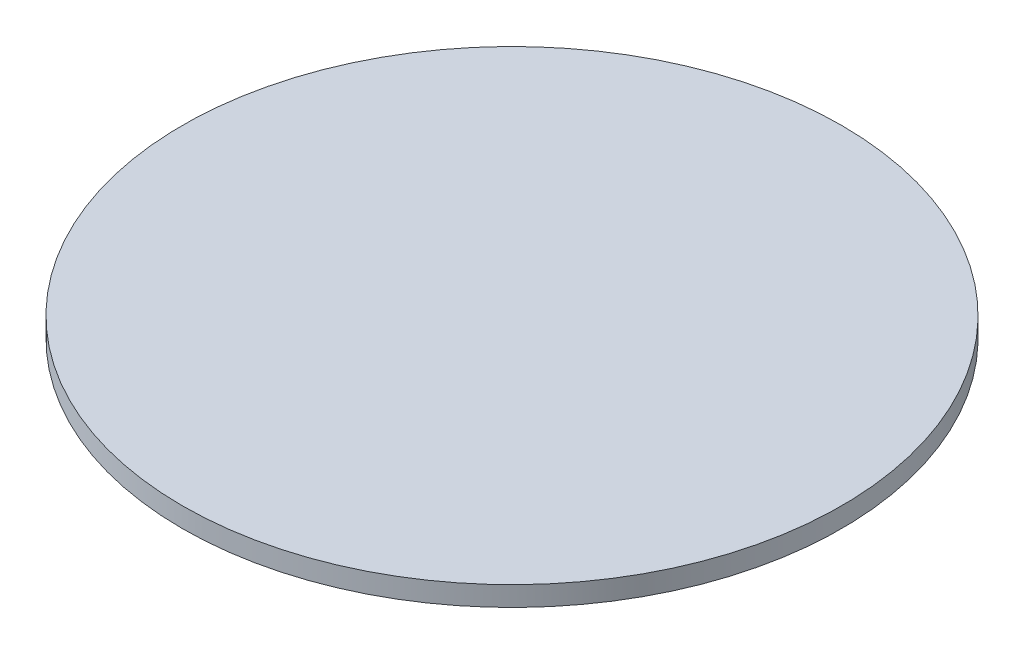
ISO-10303-21;
HEADER;
FILE_DESCRIPTION(('STEP AP214'),'2;1');
FILE_NAME('part.step','',(''),(''),'','','');
FILE_SCHEMA(('AUTOMOTIVE_DESIGN { 1 0 10303 214 1 1 1 1 }'));
ENDSEC;
DATA;
#1=APPLICATION_CONTEXT('core data for automotive mechanical design processes');
#2=APPLICATION_PROTOCOL_DEFINITION('international standard','automotive_design',2000,#1);
#3=PRODUCT_CONTEXT('',#1,'mechanical');
#4=PRODUCT('Part','Part','',(#3));
#5=PRODUCT_RELATED_PRODUCT_CATEGORY('part','',(#4));
#6=PRODUCT_DEFINITION_FORMATION('','',#4);
#7=PRODUCT_DEFINITION_CONTEXT('part definition',#1,'design');
#8=PRODUCT_DEFINITION('design','',#6,#7);
#9=PRODUCT_DEFINITION_SHAPE('','',#8);
#10=(LENGTH_UNIT() NAMED_UNIT(*) SI_UNIT(.MILLI.,.METRE.));
#11=(NAMED_UNIT(*) PLANE_ANGLE_UNIT() SI_UNIT($,.RADIAN.));
#12=(NAMED_UNIT(*) SI_UNIT($,.STERADIAN.) SOLID_ANGLE_UNIT());
#13=UNCERTAINTY_MEASURE_WITH_UNIT(LENGTH_MEASURE(1.E-05),#10,'distance_accuracy_value','');
#14=(GEOMETRIC_REPRESENTATION_CONTEXT(3) GLOBAL_UNCERTAINTY_ASSIGNED_CONTEXT((#13)) GLOBAL_UNIT_ASSIGNED_CONTEXT((#10,
#11,#12)) REPRESENTATION_CONTEXT('',''));
#15=CARTESIAN_POINT('',(0.,0.,0.));
#16=DIRECTION('',(0.,0.,1.));
#17=DIRECTION('',(1.,0.,0.));
#18=AXIS2_PLACEMENT_3D('',#15,#16,#17);
#19=CARTESIAN_POINT('',(0.,3.,0.));
#20=DIRECTION('',(0.,-1.,0.));
#21=DIRECTION('',(0.,0.,-1.));
#22=AXIS2_PLACEMENT_3D('',#19,#20,#21);
#23=CYLINDRICAL_SURFACE('',#22,50.);
#24=CARTESIAN_POINT('',(0.,3.,0.));
#25=DIRECTION('',(0.,1.,0.));
#26=DIRECTION('',(0.,0.,1.));
#27=AXIS2_PLACEMENT_3D('',#24,#25,#26);
#28=CIRCLE('',#27,50.);
#29=CARTESIAN_POINT('',(0.,3.,50.));
#30=VERTEX_POINT('',#29);
#31=EDGE_CURVE('E41',#30,#30,#28,.T.);
#32=ORIENTED_EDGE('',*,*,#31,.F.);
#33=EDGE_LOOP('',(#32));
#34=FACE_BOUND('',#33,.T.);
#35=CARTESIAN_POINT('',(0.,0.,0.));
#36=DIRECTION('',(0.,1.,0.));
#37=DIRECTION('',(0.,0.,1.));
#38=AXIS2_PLACEMENT_3D('',#35,#36,#37);
#39=CIRCLE('',#38,50.);
#40=CARTESIAN_POINT('',(0.,0.,50.));
#41=VERTEX_POINT('',#40);
#42=EDGE_CURVE('E45',#41,#41,#39,.T.);
#43=ORIENTED_EDGE('',*,*,#42,.T.);
#44=EDGE_LOOP('',(#43));
#45=FACE_BOUND('',#44,.T.);
#46=ADVANCED_FACE('F35',(#34,#45),#23,.T.);
#47=CARTESIAN_POINT('',(0.,3.,0.));
#48=DIRECTION('',(0.,1.,0.));
#49=DIRECTION('',(0.,0.,1.));
#50=AXIS2_PLACEMENT_3D('',#47,#48,#49);
#51=PLANE('',#50);
#52=ORIENTED_EDGE('',*,*,#31,.T.);
#53=EDGE_LOOP('',(#52));
#54=FACE_BOUND('',#53,.T.);
#55=ADVANCED_FACE('F76',(#54),#51,.T.);
#56=CARTESIAN_POINT('',(0.,0.,0.));
#57=DIRECTION('',(0.,1.,0.));
#58=DIRECTION('',(0.,0.,1.));
#59=AXIS2_PLACEMENT_3D('',#56,#57,#58);
#60=PLANE('',#59);
#61=CARTESIAN_POINT('',(0.,0.,0.));
#62=DIRECTION('',(0.,1.,0.));
#63=DIRECTION('',(0.,0.,1.));
#64=AXIS2_PLACEMENT_3D('',#61,#62,#63);
#65=CIRCLE('',#64,4.);
#66=CARTESIAN_POINT('',(0.,0.,4.));
#67=VERTEX_POINT('',#66);
#68=EDGE_CURVE('E10',#67,#67,#65,.F.);
#69=ORIENTED_EDGE('',*,*,#68,.F.);
#70=EDGE_LOOP('',(#69));
#71=FACE_BOUND('',#70,.T.);
#72=ORIENTED_EDGE('',*,*,#42,.F.);
#73=EDGE_LOOP('',(#72));
#74=FACE_BOUND('',#73,.T.);
#75=ADVANCED_FACE('F67',(#71,#74),#60,.F.);
#76=CARTESIAN_POINT('',(0.,-6.,0.));
#77=DIRECTION('',(0.,-1.,0.));
#78=DIRECTION('',(0.,0.,-1.));
#79=AXIS2_PLACEMENT_3D('',#76,#77,#78);
#80=PLANE('',#79);
#81=CARTESIAN_POINT('',(0.,-6.,0.));
#82=DIRECTION('',(0.,-1.,0.));
#83=DIRECTION('',(0.,0.,-1.));
#84=AXIS2_PLACEMENT_3D('',#81,#82,#83);
#85=CIRCLE('',#84,4.);
#86=CARTESIAN_POINT('',(0.,-6.,-4.));
#87=VERTEX_POINT('',#86);
#88=EDGE_CURVE('E50',#87,#87,#85,.T.);
#89=ORIENTED_EDGE('',*,*,#88,.T.);
#90=EDGE_LOOP('',(#89));
#91=FACE_BOUND('',#90,.T.);
#92=CARTESIAN_POINT('',(0.,-6.,0.));
#93=DIRECTION('',(0.,-1.,0.));
#94=DIRECTION('',(0.,0.,-1.));
#95=AXIS2_PLACEMENT_3D('',#92,#93,#94);
#96=CIRCLE('',#95,2.5);
#97=CARTESIAN_POINT('',(0.,-6.,-2.5));
#98=VERTEX_POINT('',#97);
#99=EDGE_CURVE('E54',#98,#98,#96,.T.);
#100=ORIENTED_EDGE('',*,*,#99,.F.);
#101=EDGE_LOOP('',(#100));
#102=FACE_BOUND('',#101,.T.);
#103=ADVANCED_FACE('F64',(#91,#102),#80,.T.);
#104=CARTESIAN_POINT('',(0.,-6.,0.));
#105=DIRECTION('',(0.,1.,0.));
#106=DIRECTION('',(0.,0.,1.));
#107=AXIS2_PLACEMENT_3D('',#104,#105,#106);
#108=CYLINDRICAL_SURFACE('',#107,4.);
#109=ORIENTED_EDGE('',*,*,#88,.F.);
#110=EDGE_LOOP('',(#109));
#111=FACE_BOUND('',#110,.T.);
#112=ORIENTED_EDGE('',*,*,#68,.T.);
#113=EDGE_LOOP('',(#112));
#114=FACE_BOUND('',#113,.T.);
#115=ADVANCED_FACE('F66',(#111,#114),#108,.T.);
#116=CARTESIAN_POINT('',(0.,-6.,0.));
#117=DIRECTION('',(0.,1.,0.));
#118=DIRECTION('',(0.,0.,1.));
#119=AXIS2_PLACEMENT_3D('',#116,#117,#118);
#120=CYLINDRICAL_SURFACE('',#119,2.5);
#121=ORIENTED_EDGE('',*,*,#99,.T.);
#122=EDGE_LOOP('',(#121));
#123=FACE_BOUND('',#122,.T.);
#124=CARTESIAN_POINT('',(0.,0.,0.));
#125=DIRECTION('',(0.,-1.,0.));
#126=DIRECTION('',(0.,0.,-1.));
#127=AXIS2_PLACEMENT_3D('',#124,#125,#126);
#128=CIRCLE('',#127,2.5);
#129=CARTESIAN_POINT('',(0.,0.,-2.5));
#130=VERTEX_POINT('',#129);
#131=EDGE_CURVE('E55',#130,#130,#128,.T.);
#132=ORIENTED_EDGE('',*,*,#131,.F.);
#133=EDGE_LOOP('',(#132));
#134=FACE_BOUND('',#133,.T.);
#135=ADVANCED_FACE('F61',(#123,#134),#120,.F.);
#136=ORIENTED_EDGE('',*,*,#131,.T.);
#137=EDGE_LOOP('',(#136));
#138=FACE_BOUND('',#137,.T.);
#139=ADVANCED_FACE('F78',(#138),#60,.F.);
#140=CLOSED_SHELL('',(#46,#55,#75,#103,#115,#135,#139));
#141=MANIFOLD_SOLID_BREP('B2',#140);
#142=ADVANCED_BREP_SHAPE_REPRESENTATION('',(#18,#141),#14);
#143=SHAPE_DEFINITION_REPRESENTATION(#9,#142);
ENDSEC;
END-ISO-10303-21;
